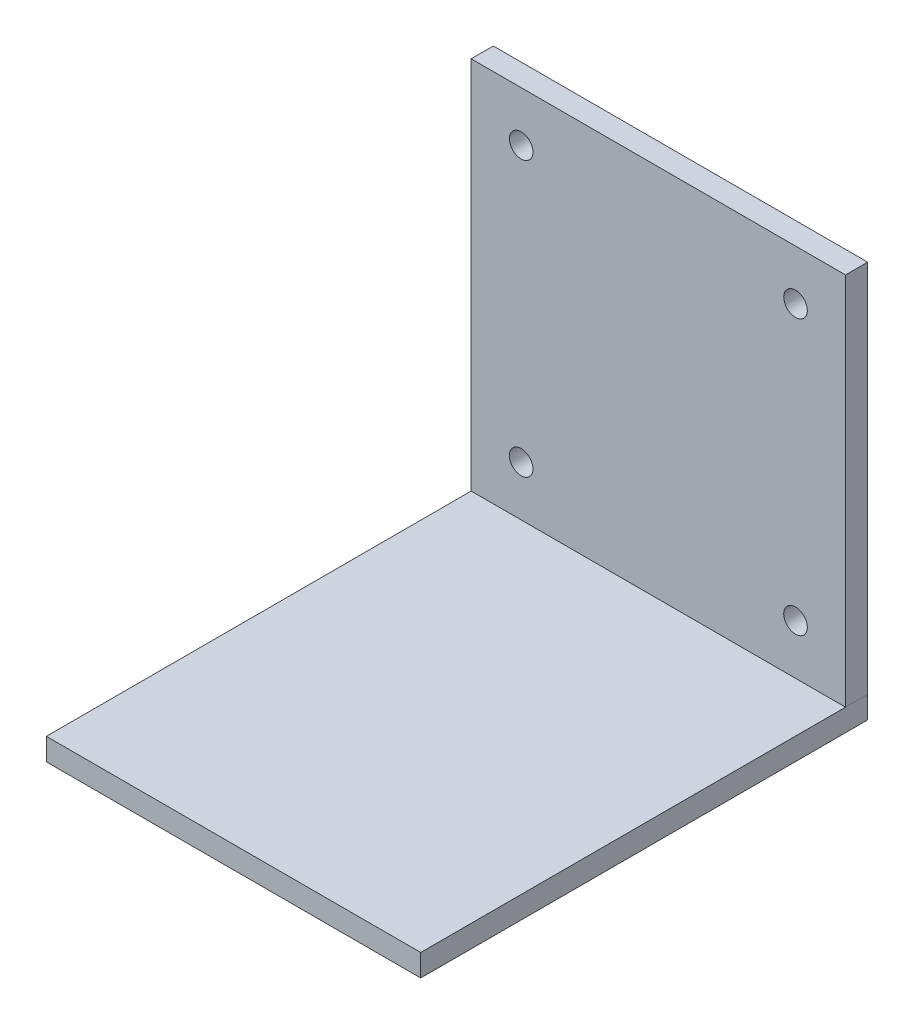
ISO-10303-21;
HEADER;
FILE_DESCRIPTION(('STEP AP214'),'2;1');
FILE_NAME('part.step','',(''),(''),'','','');
FILE_SCHEMA(('AUTOMOTIVE_DESIGN { 1 0 10303 214 1 1 1 1 }'));
ENDSEC;
DATA;
#1=APPLICATION_CONTEXT('core data for automotive mechanical design processes');
#2=APPLICATION_PROTOCOL_DEFINITION('international standard','automotive_design',2000,#1);
#3=PRODUCT_CONTEXT('',#1,'mechanical');
#4=PRODUCT('Part','Part','',(#3));
#5=PRODUCT_RELATED_PRODUCT_CATEGORY('part','',(#4));
#6=PRODUCT_DEFINITION_FORMATION('','',#4);
#7=PRODUCT_DEFINITION_CONTEXT('part definition',#1,'design');
#8=PRODUCT_DEFINITION('design','',#6,#7);
#9=PRODUCT_DEFINITION_SHAPE('','',#8);
#10=(LENGTH_UNIT() NAMED_UNIT(*) SI_UNIT(.MILLI.,.METRE.));
#11=(NAMED_UNIT(*) PLANE_ANGLE_UNIT() SI_UNIT($,.RADIAN.));
#12=(NAMED_UNIT(*) SI_UNIT($,.STERADIAN.) SOLID_ANGLE_UNIT());
#13=UNCERTAINTY_MEASURE_WITH_UNIT(LENGTH_MEASURE(1.E-05),#10,'distance_accuracy_value','');
#14=(GEOMETRIC_REPRESENTATION_CONTEXT(3) GLOBAL_UNCERTAINTY_ASSIGNED_CONTEXT((#13)) GLOBAL_UNIT_ASSIGNED_CONTEXT((#10,
#11,#12)) REPRESENTATION_CONTEXT('',''));
#15=CARTESIAN_POINT('',(0.,0.,0.));
#16=DIRECTION('',(0.,0.,1.));
#17=DIRECTION('',(1.,0.,0.));
#18=AXIS2_PLACEMENT_3D('',#15,#16,#17);
#19=CARTESIAN_POINT('',(21.15,-23.65,2.5));
#20=DIRECTION('',(-1.,0.,0.));
#21=DIRECTION('',(0.,-1.,0.));
#22=AXIS2_PLACEMENT_3D('',#19,#20,#21);
#23=PLANE('',#22);
#24=DIRECTION('',(0.,0.,1.));
#25=VECTOR('',#24,1.);
#26=CARTESIAN_POINT('',(21.15,-21.15,2.5));
#27=LINE('',#26,#25);
#28=CARTESIAN_POINT('',(21.15,-21.15,0.));
#29=VERTEX_POINT('',#28);
#30=CARTESIAN_POINT('',(21.15,-21.15,50.5));
#31=VERTEX_POINT('',#30);
#32=EDGE_CURVE('E84',#29,#31,#27,.T.);
#33=ORIENTED_EDGE('',*,*,#32,.T.);
#34=DIRECTION('',(0.,1.,0.));
#35=VECTOR('',#34,1.);
#36=CARTESIAN_POINT('',(21.15,-23.65,50.5));
#37=LINE('',#36,#35);
#38=CARTESIAN_POINT('',(21.15,-23.65,50.5));
#39=VERTEX_POINT('',#38);
#40=EDGE_CURVE('E12',#39,#31,#37,.T.);
#41=ORIENTED_EDGE('',*,*,#40,.F.);
#42=DIRECTION('',(0.,0.,1.));
#43=VECTOR('',#42,1.);
#44=CARTESIAN_POINT('',(21.15,-23.65,0.));
#45=LINE('',#44,#43);
#46=CARTESIAN_POINT('',(21.15,-23.65,0.));
#47=VERTEX_POINT('',#46);
#48=EDGE_CURVE('E89',#47,#39,#45,.T.);
#49=ORIENTED_EDGE('',*,*,#48,.F.);
#50=DIRECTION('',(0.,1.,0.));
#51=VECTOR('',#50,1.);
#52=CARTESIAN_POINT('',(21.15,-23.65,0.));
#53=LINE('',#52,#51);
#54=EDGE_CURVE('E105',#47,#29,#53,.T.);
#55=ORIENTED_EDGE('',*,*,#54,.T.);
#56=EDGE_LOOP('',(#33,#41,#49,#55));
#57=FACE_BOUND('',#56,.T.);
#58=ADVANCED_FACE('F45',(#57),#23,.F.);
#59=CARTESIAN_POINT('',(21.15,-23.65,50.5));
#60=DIRECTION('',(0.,0.,-1.));
#61=DIRECTION('',(-1.,0.,0.));
#62=AXIS2_PLACEMENT_3D('',#59,#60,#61);
#63=PLANE('',#62);
#64=DIRECTION('',(-1.,0.,0.));
#65=VECTOR('',#64,1.);
#66=CARTESIAN_POINT('',(21.15,-21.15,50.5));
#67=LINE('',#66,#65);
#68=CARTESIAN_POINT('',(-21.15,-21.15,50.5));
#69=VERTEX_POINT('',#68);
#70=EDGE_CURVE('E101',#31,#69,#67,.T.);
#71=ORIENTED_EDGE('',*,*,#70,.T.);
#72=DIRECTION('',(0.,1.,0.));
#73=VECTOR('',#72,1.);
#74=CARTESIAN_POINT('',(-21.15,-23.65,50.5));
#75=LINE('',#74,#73);
#76=CARTESIAN_POINT('',(-21.15,-23.65,50.5));
#77=VERTEX_POINT('',#76);
#78=EDGE_CURVE('E53',#77,#69,#75,.T.);
#79=ORIENTED_EDGE('',*,*,#78,.F.);
#80=DIRECTION('',(-1.,0.,0.));
#81=VECTOR('',#80,1.);
#82=CARTESIAN_POINT('',(21.15,-23.65,50.5));
#83=LINE('',#82,#81);
#84=EDGE_CURVE('E92',#39,#77,#83,.T.);
#85=ORIENTED_EDGE('',*,*,#84,.F.);
#86=ORIENTED_EDGE('',*,*,#40,.T.);
#87=EDGE_LOOP('',(#71,#79,#85,#86));
#88=FACE_BOUND('',#87,.T.);
#89=ADVANCED_FACE('F100',(#88),#63,.F.);
#90=CARTESIAN_POINT('',(-21.15,-23.65,0.));
#91=DIRECTION('',(1.,0.,0.));
#92=DIRECTION('',(0.,1.,0.));
#93=AXIS2_PLACEMENT_3D('',#90,#91,#92);
#94=PLANE('',#93);
#95=DIRECTION('',(0.,0.,-1.));
#96=VECTOR('',#95,1.);
#97=CARTESIAN_POINT('',(-21.15,-21.15,0.));
#98=LINE('',#97,#96);
#99=CARTESIAN_POINT('',(-21.15,-21.15,0.));
#100=VERTEX_POINT('',#99);
#101=EDGE_CURVE('E77',#69,#100,#98,.T.);
#102=ORIENTED_EDGE('',*,*,#101,.T.);
#103=DIRECTION('',(0.,1.,0.));
#104=VECTOR('',#103,1.);
#105=CARTESIAN_POINT('',(-21.15,-23.65,0.));
#106=LINE('',#105,#104);
#107=CARTESIAN_POINT('',(-21.15,-23.65,0.));
#108=VERTEX_POINT('',#107);
#109=EDGE_CURVE('E102',#108,#100,#106,.T.);
#110=ORIENTED_EDGE('',*,*,#109,.F.);
#111=DIRECTION('',(0.,0.,-1.));
#112=VECTOR('',#111,1.);
#113=CARTESIAN_POINT('',(-21.15,-23.65,2.5));
#114=LINE('',#113,#112);
#115=EDGE_CURVE('E96',#77,#108,#114,.T.);
#116=ORIENTED_EDGE('',*,*,#115,.F.);
#117=ORIENTED_EDGE('',*,*,#78,.T.);
#118=EDGE_LOOP('',(#102,#110,#116,#117));
#119=FACE_BOUND('',#118,.T.);
#120=ADVANCED_FACE('F103',(#119),#94,.F.);
#121=CARTESIAN_POINT('',(21.15,-23.65,0.));
#122=DIRECTION('',(0.,0.,1.));
#123=DIRECTION('',(1.,0.,0.));
#124=AXIS2_PLACEMENT_3D('',#121,#122,#123);
#125=PLANE('',#124);
#126=DIRECTION('',(1.,0.,0.));
#127=VECTOR('',#126,1.);
#128=CARTESIAN_POINT('',(21.15,-21.15,0.));
#129=LINE('',#128,#127);
#130=EDGE_CURVE('E112',#100,#29,#129,.T.);
#131=ORIENTED_EDGE('',*,*,#130,.T.);
#132=ORIENTED_EDGE('',*,*,#54,.F.);
#133=DIRECTION('',(1.,0.,0.));
#134=VECTOR('',#133,1.);
#135=CARTESIAN_POINT('',(21.15,-23.65,0.));
#136=LINE('',#135,#134);
#137=EDGE_CURVE('E61',#108,#47,#136,.T.);
#138=ORIENTED_EDGE('',*,*,#137,.F.);
#139=ORIENTED_EDGE('',*,*,#109,.T.);
#140=EDGE_LOOP('',(#131,#132,#138,#139));
#141=FACE_BOUND('',#140,.T.);
#142=ADVANCED_FACE('F117',(#141),#125,.F.);
#143=CARTESIAN_POINT('',(0.,-23.65,0.));
#144=DIRECTION('',(0.,-1.,0.));
#145=DIRECTION('',(1.,0.,0.));
#146=AXIS2_PLACEMENT_3D('',#143,#144,#145);
#147=PLANE('',#146);
#148=ORIENTED_EDGE('',*,*,#48,.T.);
#149=ORIENTED_EDGE('',*,*,#84,.T.);
#150=ORIENTED_EDGE('',*,*,#115,.T.);
#151=ORIENTED_EDGE('',*,*,#137,.T.);
#152=EDGE_LOOP('',(#148,#149,#150,#151));
#153=FACE_BOUND('',#152,.T.);
#154=ADVANCED_FACE('F94',(#153),#147,.T.);
#155=CARTESIAN_POINT('',(0.,-21.15,0.));
#156=DIRECTION('',(0.,-1.,0.));
#157=DIRECTION('',(1.,0.,0.));
#158=AXIS2_PLACEMENT_3D('',#155,#156,#157);
#159=PLANE('',#158);
#160=ORIENTED_EDGE('',*,*,#32,.F.);
#161=ORIENTED_EDGE('',*,*,#130,.F.);
#162=ORIENTED_EDGE('',*,*,#101,.F.);
#163=ORIENTED_EDGE('',*,*,#70,.F.);
#164=EDGE_LOOP('',(#160,#161,#162,#163));
#165=FACE_BOUND('',#164,.T.);
#166=ADVANCED_FACE('F118',(#165),#159,.F.);
#167=CLOSED_SHELL('',(#58,#89,#120,#142,#154,#166));
#168=MANIFOLD_SOLID_BREP('B2',#167);
#169=CARTESIAN_POINT('',(0.,0.,2.5));
#170=DIRECTION('',(0.,0.,-1.));
#171=DIRECTION('',(-1.,0.,0.));
#172=AXIS2_PLACEMENT_3D('',#169,#170,#171);
#173=PLANE('',#172);
#174=DIRECTION('',(0.,1.,0.));
#175=VECTOR('',#174,1.);
#176=CARTESIAN_POINT('',(21.15,-21.15,2.5));
#177=LINE('',#176,#175);
#178=CARTESIAN_POINT('',(21.15,-21.15,2.5));
#179=VERTEX_POINT('',#178);
#180=CARTESIAN_POINT('',(21.15,21.15,2.5));
#181=VERTEX_POINT('',#180);
#182=EDGE_CURVE('E227',#179,#181,#177,.T.);
#183=ORIENTED_EDGE('',*,*,#182,.T.);
#184=DIRECTION('',(-1.,0.,0.));
#185=VECTOR('',#184,1.);
#186=CARTESIAN_POINT('',(-21.15,21.15,2.5));
#187=LINE('',#186,#185);
#188=CARTESIAN_POINT('',(-21.15,21.15,2.5));
#189=VERTEX_POINT('',#188);
#190=EDGE_CURVE('E222',#181,#189,#187,.T.);
#191=ORIENTED_EDGE('',*,*,#190,.T.);
#192=DIRECTION('',(0.,-1.,0.));
#193=VECTOR('',#192,1.);
#194=CARTESIAN_POINT('',(-21.15,-21.15,2.5));
#195=LINE('',#194,#193);
#196=CARTESIAN_POINT('',(-21.15,-21.15,2.5));
#197=VERTEX_POINT('',#196);
#198=EDGE_CURVE('E225',#189,#197,#195,.T.);
#199=ORIENTED_EDGE('',*,*,#198,.T.);
#200=DIRECTION('',(1.,0.,0.));
#201=VECTOR('',#200,1.);
#202=CARTESIAN_POINT('',(-21.15,-21.15,2.5));
#203=LINE('',#202,#201);
#204=EDGE_CURVE('E192',#197,#179,#203,.T.);
#205=ORIENTED_EDGE('',*,*,#204,.T.);
#206=EDGE_LOOP('',(#183,#191,#199,#205));
#207=FACE_BOUND('',#206,.T.);
#208=CARTESIAN_POINT('',(-15.5,15.5,2.5));
#209=DIRECTION('',(0.,0.,1.));
#210=DIRECTION('',(1.,0.,0.));
#211=AXIS2_PLACEMENT_3D('',#208,#209,#210);
#212=CIRCLE('',#211,1.3335);
#213=CARTESIAN_POINT('',(-14.1665,15.5,2.5));
#214=VERTEX_POINT('',#213);
#215=EDGE_CURVE('E242',#214,#214,#212,.T.);
#216=ORIENTED_EDGE('',*,*,#215,.F.);
#217=EDGE_LOOP('',(#216));
#218=FACE_BOUND('',#217,.T.);
#219=CARTESIAN_POINT('',(15.5,15.5,2.5));
#220=DIRECTION('',(0.,0.,1.));
#221=DIRECTION('',(-1.,0.,0.));
#222=AXIS2_PLACEMENT_3D('',#219,#220,#221);
#223=CIRCLE('',#222,1.3335);
#224=CARTESIAN_POINT('',(14.1665,15.5,2.5));
#225=VERTEX_POINT('',#224);
#226=EDGE_CURVE('E257',#225,#225,#223,.T.);
#227=ORIENTED_EDGE('',*,*,#226,.F.);
#228=EDGE_LOOP('',(#227));
#229=FACE_BOUND('',#228,.T.);
#230=CARTESIAN_POINT('',(15.5,-15.5,2.5));
#231=DIRECTION('',(0.,0.,1.));
#232=DIRECTION('',(1.,0.,0.));
#233=AXIS2_PLACEMENT_3D('',#230,#231,#232);
#234=CIRCLE('',#233,1.3335);
#235=CARTESIAN_POINT('',(16.8335,-15.5,2.5));
#236=VERTEX_POINT('',#235);
#237=EDGE_CURVE('E263',#236,#236,#234,.T.);
#238=ORIENTED_EDGE('',*,*,#237,.F.);
#239=EDGE_LOOP('',(#238));
#240=FACE_BOUND('',#239,.T.);
#241=CARTESIAN_POINT('',(-15.5,-15.5,2.5));
#242=DIRECTION('',(0.,0.,1.));
#243=DIRECTION('',(-1.,0.,0.));
#244=AXIS2_PLACEMENT_3D('',#241,#242,#243);
#245=CIRCLE('',#244,1.3335);
#246=CARTESIAN_POINT('',(-16.8335,-15.5,2.5));
#247=VERTEX_POINT('',#246);
#248=EDGE_CURVE('E269',#247,#247,#245,.T.);
#249=ORIENTED_EDGE('',*,*,#248,.F.);
#250=EDGE_LOOP('',(#249));
#251=FACE_BOUND('',#250,.T.);
#252=ADVANCED_FACE('F175',(#207,#218,#229,#240,#251),#173,.F.);
#253=CARTESIAN_POINT('',(0.,0.,0.));
#254=DIRECTION('',(0.,0.,-1.));
#255=DIRECTION('',(-1.,0.,0.));
#256=AXIS2_PLACEMENT_3D('',#253,#254,#255);
#257=PLANE('',#256);
#258=CARTESIAN_POINT('',(15.5,-15.5,0.));
#259=DIRECTION('',(0.,0.,1.));
#260=DIRECTION('',(1.,0.,0.));
#261=AXIS2_PLACEMENT_3D('',#258,#259,#260);
#262=CIRCLE('',#261,1.3335);
#263=CARTESIAN_POINT('',(16.8335,-15.5,0.));
#264=VERTEX_POINT('',#263);
#265=EDGE_CURVE('E266',#264,#264,#262,.T.);
#266=ORIENTED_EDGE('',*,*,#265,.T.);
#267=EDGE_LOOP('',(#266));
#268=FACE_BOUND('',#267,.T.);
#269=CARTESIAN_POINT('',(-15.5,15.5,0.));
#270=DIRECTION('',(0.,0.,1.));
#271=DIRECTION('',(1.,0.,0.));
#272=AXIS2_PLACEMENT_3D('',#269,#270,#271);
#273=CIRCLE('',#272,1.3335);
#274=CARTESIAN_POINT('',(-14.1665,15.5,0.));
#275=VERTEX_POINT('',#274);
#276=EDGE_CURVE('E254',#275,#275,#273,.T.);
#277=ORIENTED_EDGE('',*,*,#276,.T.);
#278=EDGE_LOOP('',(#277));
#279=FACE_BOUND('',#278,.T.);
#280=DIRECTION('',(0.,1.,0.));
#281=VECTOR('',#280,1.);
#282=CARTESIAN_POINT('',(21.15,-21.15,0.));
#283=LINE('',#282,#281);
#284=CARTESIAN_POINT('',(21.15,-21.15,0.));
#285=VERTEX_POINT('',#284);
#286=CARTESIAN_POINT('',(21.15,21.15,0.));
#287=VERTEX_POINT('',#286);
#288=EDGE_CURVE('E239',#285,#287,#283,.T.);
#289=ORIENTED_EDGE('',*,*,#288,.F.);
#290=DIRECTION('',(1.,0.,0.));
#291=VECTOR('',#290,1.);
#292=CARTESIAN_POINT('',(-21.15,-21.15,0.));
#293=LINE('',#292,#291);
#294=CARTESIAN_POINT('',(-21.15,-21.15,0.));
#295=VERTEX_POINT('',#294);
#296=EDGE_CURVE('E215',#295,#285,#293,.T.);
#297=ORIENTED_EDGE('',*,*,#296,.F.);
#298=DIRECTION('',(0.,-1.,0.));
#299=VECTOR('',#298,1.);
#300=CARTESIAN_POINT('',(-21.15,-21.15,0.));
#301=LINE('',#300,#299);
#302=CARTESIAN_POINT('',(-21.15,21.15,0.));
#303=VERTEX_POINT('',#302);
#304=EDGE_CURVE('E209',#303,#295,#301,.T.);
#305=ORIENTED_EDGE('',*,*,#304,.F.);
#306=DIRECTION('',(-1.,0.,0.));
#307=VECTOR('',#306,1.);
#308=CARTESIAN_POINT('',(-21.15,21.15,0.));
#309=LINE('',#308,#307);
#310=EDGE_CURVE('E231',#287,#303,#309,.T.);
#311=ORIENTED_EDGE('',*,*,#310,.F.);
#312=EDGE_LOOP('',(#289,#297,#305,#311));
#313=FACE_BOUND('',#312,.T.);
#314=CARTESIAN_POINT('',(15.5,15.5,0.));
#315=DIRECTION('',(0.,0.,1.));
#316=DIRECTION('',(-1.,0.,0.));
#317=AXIS2_PLACEMENT_3D('',#314,#315,#316);
#318=CIRCLE('',#317,1.3335);
#319=CARTESIAN_POINT('',(14.1665,15.5,0.));
#320=VERTEX_POINT('',#319);
#321=EDGE_CURVE('E260',#320,#320,#318,.T.);
#322=ORIENTED_EDGE('',*,*,#321,.T.);
#323=EDGE_LOOP('',(#322));
#324=FACE_BOUND('',#323,.T.);
#325=CARTESIAN_POINT('',(-15.5,-15.5,0.));
#326=DIRECTION('',(0.,0.,1.));
#327=DIRECTION('',(-1.,0.,0.));
#328=AXIS2_PLACEMENT_3D('',#325,#326,#327);
#329=CIRCLE('',#328,1.3335);
#330=CARTESIAN_POINT('',(-16.8335,-15.5,0.));
#331=VERTEX_POINT('',#330);
#332=EDGE_CURVE('E272',#331,#331,#329,.T.);
#333=ORIENTED_EDGE('',*,*,#332,.T.);
#334=EDGE_LOOP('',(#333));
#335=FACE_BOUND('',#334,.T.);
#336=ADVANCED_FACE('F250',(#268,#279,#313,#324,#335),#257,.T.);
#337=CARTESIAN_POINT('',(21.15,-21.15,2.5));
#338=DIRECTION('',(-1.,0.,0.));
#339=DIRECTION('',(0.,0.,1.));
#340=AXIS2_PLACEMENT_3D('',#337,#338,#339);
#341=PLANE('',#340);
#342=ORIENTED_EDGE('',*,*,#288,.T.);
#343=DIRECTION('',(0.,0.,-1.));
#344=VECTOR('',#343,1.);
#345=CARTESIAN_POINT('',(21.15,21.15,2.5));
#346=LINE('',#345,#344);
#347=EDGE_CURVE('E43',#181,#287,#346,.T.);
#348=ORIENTED_EDGE('',*,*,#347,.F.);
#349=ORIENTED_EDGE('',*,*,#182,.F.);
#350=DIRECTION('',(0.,0.,-1.));
#351=VECTOR('',#350,1.);
#352=CARTESIAN_POINT('',(21.15,-21.15,2.5));
#353=LINE('',#352,#351);
#354=EDGE_CURVE('E235',#179,#285,#353,.T.);
#355=ORIENTED_EDGE('',*,*,#354,.T.);
#356=EDGE_LOOP('',(#342,#348,#349,#355));
#357=FACE_BOUND('',#356,.T.);
#358=ADVANCED_FACE('F177',(#357),#341,.F.);
#359=CARTESIAN_POINT('',(-21.15,21.15,2.5));
#360=DIRECTION('',(0.,-1.,0.));
#361=DIRECTION('',(0.,0.,-1.));
#362=AXIS2_PLACEMENT_3D('',#359,#360,#361);
#363=PLANE('',#362);
#364=ORIENTED_EDGE('',*,*,#310,.T.);
#365=DIRECTION('',(0.,0.,-1.));
#366=VECTOR('',#365,1.);
#367=CARTESIAN_POINT('',(-21.15,21.15,2.5));
#368=LINE('',#367,#366);
#369=EDGE_CURVE('E184',#189,#303,#368,.T.);
#370=ORIENTED_EDGE('',*,*,#369,.F.);
#371=ORIENTED_EDGE('',*,*,#190,.F.);
#372=ORIENTED_EDGE('',*,*,#347,.T.);
#373=EDGE_LOOP('',(#364,#370,#371,#372));
#374=FACE_BOUND('',#373,.T.);
#375=ADVANCED_FACE('F230',(#374),#363,.F.);
#376=CARTESIAN_POINT('',(-21.15,-21.15,2.5));
#377=DIRECTION('',(1.,0.,0.));
#378=DIRECTION('',(0.,0.,-1.));
#379=AXIS2_PLACEMENT_3D('',#376,#377,#378);
#380=PLANE('',#379);
#381=ORIENTED_EDGE('',*,*,#304,.T.);
#382=DIRECTION('',(0.,0.,-1.));
#383=VECTOR('',#382,1.);
#384=CARTESIAN_POINT('',(-21.15,-21.15,2.5));
#385=LINE('',#384,#383);
#386=EDGE_CURVE('E232',#197,#295,#385,.T.);
#387=ORIENTED_EDGE('',*,*,#386,.F.);
#388=ORIENTED_EDGE('',*,*,#198,.F.);
#389=ORIENTED_EDGE('',*,*,#369,.T.);
#390=EDGE_LOOP('',(#381,#387,#388,#389));
#391=FACE_BOUND('',#390,.T.);
#392=ADVANCED_FACE('F233',(#391),#380,.F.);
#393=CARTESIAN_POINT('',(-21.15,-21.15,2.5));
#394=DIRECTION('',(0.,1.,0.));
#395=DIRECTION('',(-1.,0.,0.));
#396=AXIS2_PLACEMENT_3D('',#393,#394,#395);
#397=PLANE('',#396);
#398=ORIENTED_EDGE('',*,*,#296,.T.);
#399=ORIENTED_EDGE('',*,*,#354,.F.);
#400=ORIENTED_EDGE('',*,*,#204,.F.);
#401=ORIENTED_EDGE('',*,*,#386,.T.);
#402=EDGE_LOOP('',(#398,#399,#400,#401));
#403=FACE_BOUND('',#402,.T.);
#404=ADVANCED_FACE('F247',(#403),#397,.F.);
#405=CARTESIAN_POINT('',(-15.5,15.5,2.5));
#406=DIRECTION('',(0.,0.,-1.));
#407=DIRECTION('',(-1.,0.,0.));
#408=AXIS2_PLACEMENT_3D('',#405,#406,#407);
#409=CYLINDRICAL_SURFACE('',#408,1.3335);
#410=ORIENTED_EDGE('',*,*,#215,.T.);
#411=EDGE_LOOP('',(#410));
#412=FACE_BOUND('',#411,.T.);
#413=ORIENTED_EDGE('',*,*,#276,.F.);
#414=EDGE_LOOP('',(#413));
#415=FACE_BOUND('',#414,.T.);
#416=ADVANCED_FACE('F289',(#412,#415),#409,.F.);
#417=CARTESIAN_POINT('',(15.5,15.5,2.5));
#418=DIRECTION('',(0.,0.,-1.));
#419=DIRECTION('',(-1.,0.,0.));
#420=AXIS2_PLACEMENT_3D('',#417,#418,#419);
#421=CYLINDRICAL_SURFACE('',#420,1.3335);
#422=ORIENTED_EDGE('',*,*,#226,.T.);
#423=EDGE_LOOP('',(#422));
#424=FACE_BOUND('',#423,.T.);
#425=ORIENTED_EDGE('',*,*,#321,.F.);
#426=EDGE_LOOP('',(#425));
#427=FACE_BOUND('',#426,.T.);
#428=ADVANCED_FACE('F335',(#424,#427),#421,.F.);
#429=CARTESIAN_POINT('',(15.5,-15.5,2.5));
#430=DIRECTION('',(0.,0.,-1.));
#431=DIRECTION('',(-1.,0.,0.));
#432=AXIS2_PLACEMENT_3D('',#429,#430,#431);
#433=CYLINDRICAL_SURFACE('',#432,1.3335);
#434=ORIENTED_EDGE('',*,*,#237,.T.);
#435=EDGE_LOOP('',(#434));
#436=FACE_BOUND('',#435,.T.);
#437=ORIENTED_EDGE('',*,*,#265,.F.);
#438=EDGE_LOOP('',(#437));
#439=FACE_BOUND('',#438,.T.);
#440=ADVANCED_FACE('F343',(#436,#439),#433,.F.);
#441=CARTESIAN_POINT('',(-15.5,-15.5,2.5));
#442=DIRECTION('',(0.,0.,-1.));
#443=DIRECTION('',(-1.,0.,0.));
#444=AXIS2_PLACEMENT_3D('',#441,#442,#443);
#445=CYLINDRICAL_SURFACE('',#444,1.3335);
#446=ORIENTED_EDGE('',*,*,#248,.T.);
#447=EDGE_LOOP('',(#446));
#448=FACE_BOUND('',#447,.T.);
#449=ORIENTED_EDGE('',*,*,#332,.F.);
#450=EDGE_LOOP('',(#449));
#451=FACE_BOUND('',#450,.T.);
#452=ADVANCED_FACE('F278',(#448,#451),#445,.F.);
#453=CLOSED_SHELL('',(#252,#336,#358,#375,#392,#404,#416,#428,#440,#452));
#454=MANIFOLD_SOLID_BREP('B6',#453);
#455=ADVANCED_BREP_SHAPE_REPRESENTATION('',(#18,#168,#454),#14);
#456=SHAPE_DEFINITION_REPRESENTATION(#9,#455);
ENDSEC;
END-ISO-10303-21;
